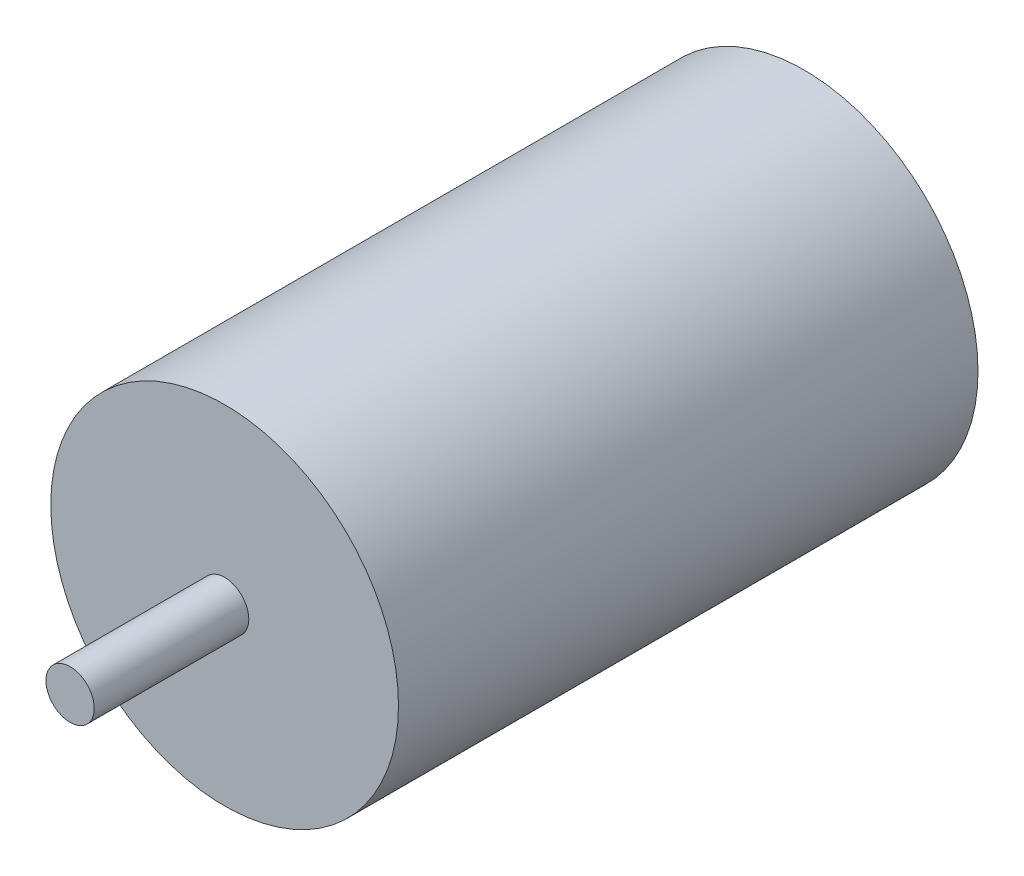
ISO-10303-21;
HEADER;
FILE_DESCRIPTION(('STEP AP214'),'2;1');
FILE_NAME('part.step','',(''),(''),'','','');
FILE_SCHEMA(('AUTOMOTIVE_DESIGN { 1 0 10303 214 1 1 1 1 }'));
ENDSEC;
DATA;
#1=APPLICATION_CONTEXT('core data for automotive mechanical design processes');
#2=APPLICATION_PROTOCOL_DEFINITION('international standard','automotive_design',2000,#1);
#3=PRODUCT_CONTEXT('',#1,'mechanical');
#4=PRODUCT('Part','Part','',(#3));
#5=PRODUCT_RELATED_PRODUCT_CATEGORY('part','',(#4));
#6=PRODUCT_DEFINITION_FORMATION('','',#4);
#7=PRODUCT_DEFINITION_CONTEXT('part definition',#1,'design');
#8=PRODUCT_DEFINITION('design','',#6,#7);
#9=PRODUCT_DEFINITION_SHAPE('','',#8);
#10=(LENGTH_UNIT() NAMED_UNIT(*) SI_UNIT(.MILLI.,.METRE.));
#11=(NAMED_UNIT(*) PLANE_ANGLE_UNIT() SI_UNIT($,.RADIAN.));
#12=(NAMED_UNIT(*) SI_UNIT($,.STERADIAN.) SOLID_ANGLE_UNIT());
#13=UNCERTAINTY_MEASURE_WITH_UNIT(LENGTH_MEASURE(1.E-05),#10,'distance_accuracy_value','');
#14=(GEOMETRIC_REPRESENTATION_CONTEXT(3) GLOBAL_UNCERTAINTY_ASSIGNED_CONTEXT((#13)) GLOBAL_UNIT_ASSIGNED_CONTEXT((#10,
#11,#12)) REPRESENTATION_CONTEXT('',''));
#15=CARTESIAN_POINT('',(0.,0.,0.));
#16=DIRECTION('',(0.,0.,1.));
#17=DIRECTION('',(1.,0.,0.));
#18=AXIS2_PLACEMENT_3D('',#15,#16,#17);
#19=CARTESIAN_POINT('',(0.,0.,60.));
#20=DIRECTION('',(0.,0.,-1.));
#21=DIRECTION('',(-1.,0.,0.));
#22=AXIS2_PLACEMENT_3D('',#19,#20,#21);
#23=CYLINDRICAL_SURFACE('',#22,18.);
#24=CARTESIAN_POINT('',(0.,0.,60.));
#25=DIRECTION('',(0.,0.,1.));
#26=DIRECTION('',(1.,0.,0.));
#27=AXIS2_PLACEMENT_3D('',#24,#25,#26);
#28=CIRCLE('',#27,18.);
#29=CARTESIAN_POINT('',(18.,0.,60.));
#30=VERTEX_POINT('',#29);
#31=EDGE_CURVE('E10',#30,#30,#28,.T.);
#32=ORIENTED_EDGE('',*,*,#31,.F.);
#33=EDGE_LOOP('',(#32));
#34=FACE_BOUND('',#33,.T.);
#35=CARTESIAN_POINT('',(0.,0.,0.));
#36=DIRECTION('',(0.,0.,1.));
#37=DIRECTION('',(1.,0.,0.));
#38=AXIS2_PLACEMENT_3D('',#35,#36,#37);
#39=CIRCLE('',#38,18.);
#40=CARTESIAN_POINT('',(18.,0.,0.));
#41=VERTEX_POINT('',#40);
#42=EDGE_CURVE('E34',#41,#41,#39,.T.);
#43=ORIENTED_EDGE('',*,*,#42,.T.);
#44=EDGE_LOOP('',(#43));
#45=FACE_BOUND('',#44,.T.);
#46=ADVANCED_FACE('F31',(#34,#45),#23,.T.);
#47=CARTESIAN_POINT('',(0.,0.,60.));
#48=DIRECTION('',(0.,0.,1.));
#49=DIRECTION('',(1.,0.,0.));
#50=AXIS2_PLACEMENT_3D('',#47,#48,#49);
#51=PLANE('',#50);
#52=CARTESIAN_POINT('',(0.,0.,60.));
#53=DIRECTION('',(0.,0.,1.));
#54=DIRECTION('',(1.,0.,0.));
#55=AXIS2_PLACEMENT_3D('',#52,#53,#54);
#56=CIRCLE('',#55,2.5);
#57=CARTESIAN_POINT('',(2.5,0.,60.));
#58=VERTEX_POINT('',#57);
#59=EDGE_CURVE('E43',#58,#58,#56,.T.);
#60=ORIENTED_EDGE('',*,*,#59,.F.);
#61=EDGE_LOOP('',(#60));
#62=FACE_BOUND('',#61,.T.);
#63=ORIENTED_EDGE('',*,*,#31,.T.);
#64=EDGE_LOOP('',(#63));
#65=FACE_BOUND('',#64,.T.);
#66=ADVANCED_FACE('F58',(#62,#65),#51,.T.);
#67=CARTESIAN_POINT('',(0.,0.,0.));
#68=DIRECTION('',(0.,0.,1.));
#69=DIRECTION('',(1.,0.,0.));
#70=AXIS2_PLACEMENT_3D('',#67,#68,#69);
#71=PLANE('',#70);
#72=ORIENTED_EDGE('',*,*,#42,.F.);
#73=EDGE_LOOP('',(#72));
#74=FACE_BOUND('',#73,.T.);
#75=ADVANCED_FACE('F54',(#74),#71,.F.);
#76=CARTESIAN_POINT('',(0.,0.,76.));
#77=DIRECTION('',(0.,0.,-1.));
#78=DIRECTION('',(-1.,0.,0.));
#79=AXIS2_PLACEMENT_3D('',#76,#77,#78);
#80=CYLINDRICAL_SURFACE('',#79,2.5);
#81=CARTESIAN_POINT('',(0.,0.,76.));
#82=DIRECTION('',(0.,0.,1.));
#83=DIRECTION('',(1.,0.,0.));
#84=AXIS2_PLACEMENT_3D('',#81,#82,#83);
#85=CIRCLE('',#84,2.5);
#86=CARTESIAN_POINT('',(2.5,0.,76.));
#87=VERTEX_POINT('',#86);
#88=EDGE_CURVE('E41',#87,#87,#85,.T.);
#89=ORIENTED_EDGE('',*,*,#88,.F.);
#90=EDGE_LOOP('',(#89));
#91=FACE_BOUND('',#90,.T.);
#92=ORIENTED_EDGE('',*,*,#59,.T.);
#93=EDGE_LOOP('',(#92));
#94=FACE_BOUND('',#93,.T.);
#95=ADVANCED_FACE('F51',(#91,#94),#80,.T.);
#96=CARTESIAN_POINT('',(0.,0.,76.));
#97=DIRECTION('',(0.,0.,1.));
#98=DIRECTION('',(1.,0.,0.));
#99=AXIS2_PLACEMENT_3D('',#96,#97,#98);
#100=PLANE('',#99);
#101=ORIENTED_EDGE('',*,*,#88,.T.);
#102=EDGE_LOOP('',(#101));
#103=FACE_BOUND('',#102,.T.);
#104=ADVANCED_FACE('F49',(#103),#100,.T.);
#105=CLOSED_SHELL('',(#46,#66,#75,#95,#104));
#106=MANIFOLD_SOLID_BREP('B2',#105);
#107=ADVANCED_BREP_SHAPE_REPRESENTATION('',(#18,#106),#14);
#108=SHAPE_DEFINITION_REPRESENTATION(#9,#107);
ENDSEC;
END-ISO-10303-21;
